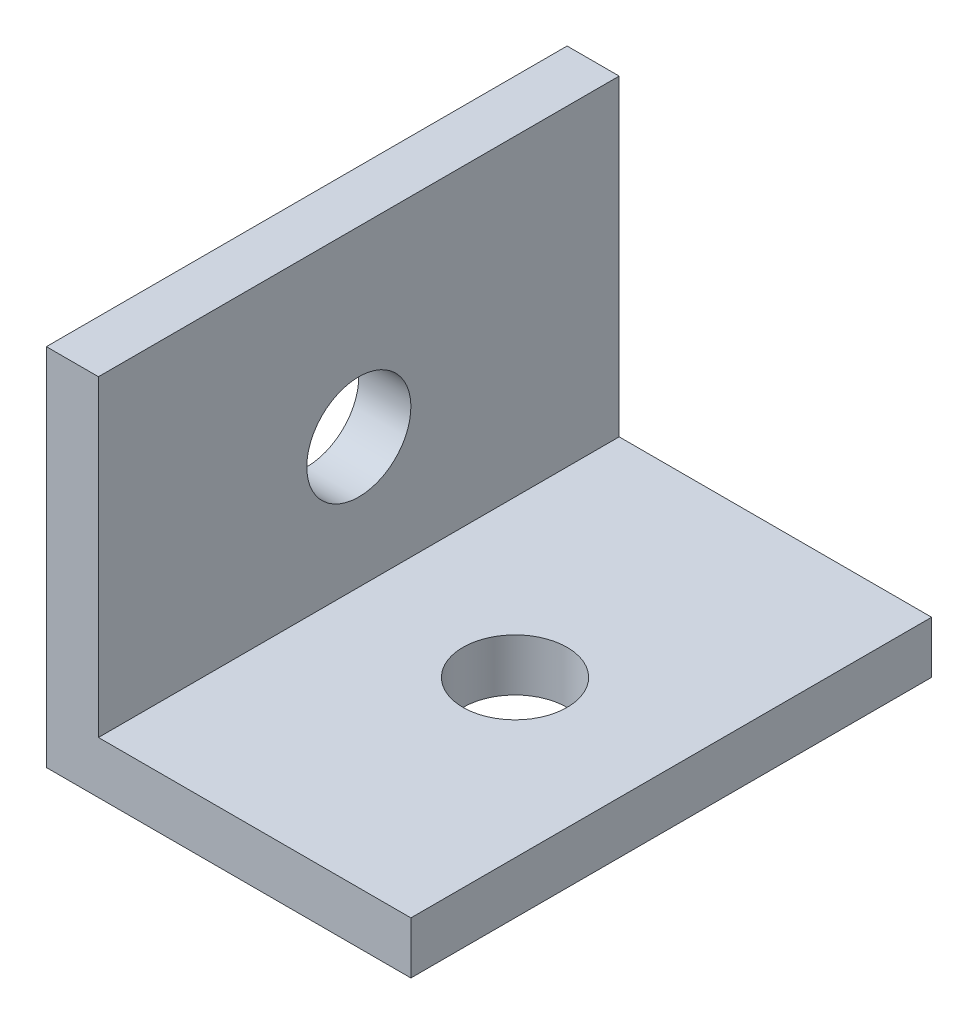
ISO-10303-21;
HEADER;
FILE_DESCRIPTION(('STEP AP214'),'2;1');
FILE_NAME('part.step','',(''),(''),'','','');
FILE_SCHEMA(('AUTOMOTIVE_DESIGN { 1 0 10303 214 1 1 1 1 }'));
ENDSEC;
DATA;
#1=APPLICATION_CONTEXT('core data for automotive mechanical design processes');
#2=APPLICATION_PROTOCOL_DEFINITION('international standard','automotive_design',2000,#1);
#3=PRODUCT_CONTEXT('',#1,'mechanical');
#4=PRODUCT('Part','Part','',(#3));
#5=PRODUCT_RELATED_PRODUCT_CATEGORY('part','',(#4));
#6=PRODUCT_DEFINITION_FORMATION('','',#4);
#7=PRODUCT_DEFINITION_CONTEXT('part definition',#1,'design');
#8=PRODUCT_DEFINITION('design','',#6,#7);
#9=PRODUCT_DEFINITION_SHAPE('','',#8);
#10=(LENGTH_UNIT() NAMED_UNIT(*) SI_UNIT(.MILLI.,.METRE.));
#11=(NAMED_UNIT(*) PLANE_ANGLE_UNIT() SI_UNIT($,.RADIAN.));
#12=(NAMED_UNIT(*) SI_UNIT($,.STERADIAN.) SOLID_ANGLE_UNIT());
#13=UNCERTAINTY_MEASURE_WITH_UNIT(LENGTH_MEASURE(1.E-05),#10,'distance_accuracy_value','');
#14=(GEOMETRIC_REPRESENTATION_CONTEXT(3) GLOBAL_UNCERTAINTY_ASSIGNED_CONTEXT((#13)) GLOBAL_UNIT_ASSIGNED_CONTEXT((#10,
#11,#12)) REPRESENTATION_CONTEXT('',''));
#15=CARTESIAN_POINT('',(0.,0.,0.));
#16=DIRECTION('',(0.,0.,1.));
#17=DIRECTION('',(1.,0.,0.));
#18=AXIS2_PLACEMENT_3D('',#15,#16,#17);
#19=CARTESIAN_POINT('',(0.,35.,50.));
#20=DIRECTION('',(1.,0.,0.));
#21=DIRECTION('',(0.,1.,0.));
#22=AXIS2_PLACEMENT_3D('',#19,#20,#21);
#23=PLANE('',#22);
#24=CARTESIAN_POINT('',(0.,17.5,25.));
#25=DIRECTION('',(-1.,0.,0.));
#26=DIRECTION('',(0.,-1.,0.));
#27=AXIS2_PLACEMENT_3D('',#24,#25,#26);
#28=CIRCLE('',#27,4.99916576836766);
#29=CARTESIAN_POINT('',(0.,12.5008342316323,25.));
#30=VERTEX_POINT('',#29);
#31=EDGE_CURVE('E183',#30,#30,#28,.T.);
#32=ORIENTED_EDGE('',*,*,#31,.F.);
#33=EDGE_LOOP('',(#32));
#34=FACE_BOUND('',#33,.T.);
#35=DIRECTION('',(0.,-1.,0.));
#36=VECTOR('',#35,1.);
#37=CARTESIAN_POINT('',(0.,35.,0.));
#38=LINE('',#37,#36);
#39=CARTESIAN_POINT('',(0.,35.,0.));
#40=VERTEX_POINT('',#39);
#41=CARTESIAN_POINT('',(0.,0.,0.));
#42=VERTEX_POINT('',#41);
#43=EDGE_CURVE('E129',#40,#42,#38,.T.);
#44=ORIENTED_EDGE('',*,*,#43,.T.);
#45=DIRECTION('',(0.,0.,-1.));
#46=VECTOR('',#45,1.);
#47=CARTESIAN_POINT('',(0.,0.,50.));
#48=LINE('',#47,#46);
#49=CARTESIAN_POINT('',(0.,0.,50.));
#50=VERTEX_POINT('',#49);
#51=EDGE_CURVE('E11',#50,#42,#48,.T.);
#52=ORIENTED_EDGE('',*,*,#51,.F.);
#53=DIRECTION('',(0.,-1.,0.));
#54=VECTOR('',#53,1.);
#55=CARTESIAN_POINT('',(0.,35.,50.));
#56=LINE('',#55,#54);
#57=CARTESIAN_POINT('',(0.,35.,50.));
#58=VERTEX_POINT('',#57);
#59=EDGE_CURVE('E145',#58,#50,#56,.T.);
#60=ORIENTED_EDGE('',*,*,#59,.F.);
#61=DIRECTION('',(0.,0.,-1.));
#62=VECTOR('',#61,1.);
#63=CARTESIAN_POINT('',(0.,35.,50.));
#64=LINE('',#63,#62);
#65=EDGE_CURVE('E125',#58,#40,#64,.T.);
#66=ORIENTED_EDGE('',*,*,#65,.T.);
#67=EDGE_LOOP('',(#44,#52,#60,#66));
#68=FACE_BOUND('',#67,.T.);
#69=ADVANCED_FACE('F39',(#34,#68),#23,.F.);
#70=CARTESIAN_POINT('',(0.,0.,50.));
#71=DIRECTION('',(0.,1.,0.));
#72=DIRECTION('',(0.,0.,1.));
#73=AXIS2_PLACEMENT_3D('',#70,#71,#72);
#74=PLANE('',#73);
#75=CARTESIAN_POINT('',(20.,0.,25.));
#76=DIRECTION('',(0.,1.,0.));
#77=DIRECTION('',(0.,0.,1.));
#78=AXIS2_PLACEMENT_3D('',#75,#76,#77);
#79=CIRCLE('',#78,5.);
#80=CARTESIAN_POINT('',(20.,0.,30.));
#81=VERTEX_POINT('',#80);
#82=EDGE_CURVE('E186',#81,#81,#79,.T.);
#83=ORIENTED_EDGE('',*,*,#82,.T.);
#84=EDGE_LOOP('',(#83));
#85=FACE_BOUND('',#84,.T.);
#86=DIRECTION('',(1.,0.,0.));
#87=VECTOR('',#86,1.);
#88=CARTESIAN_POINT('',(0.,0.,0.));
#89=LINE('',#88,#87);
#90=CARTESIAN_POINT('',(35.,0.,0.));
#91=VERTEX_POINT('',#90);
#92=EDGE_CURVE('E133',#42,#91,#89,.T.);
#93=ORIENTED_EDGE('',*,*,#92,.T.);
#94=DIRECTION('',(0.,0.,-1.));
#95=VECTOR('',#94,1.);
#96=CARTESIAN_POINT('',(35.,0.,50.));
#97=LINE('',#96,#95);
#98=CARTESIAN_POINT('',(35.,0.,50.));
#99=VERTEX_POINT('',#98);
#100=EDGE_CURVE('E49',#99,#91,#97,.T.);
#101=ORIENTED_EDGE('',*,*,#100,.F.);
#102=DIRECTION('',(1.,0.,0.));
#103=VECTOR('',#102,1.);
#104=CARTESIAN_POINT('',(0.,0.,50.));
#105=LINE('',#104,#103);
#106=EDGE_CURVE('E94',#50,#99,#105,.T.);
#107=ORIENTED_EDGE('',*,*,#106,.F.);
#108=ORIENTED_EDGE('',*,*,#51,.T.);
#109=EDGE_LOOP('',(#93,#101,#107,#108));
#110=FACE_BOUND('',#109,.T.);
#111=ADVANCED_FACE('F175',(#85,#110),#74,.F.);
#112=CARTESIAN_POINT('',(35.,0.,50.));
#113=DIRECTION('',(-1.,0.,0.));
#114=DIRECTION('',(0.,0.,1.));
#115=AXIS2_PLACEMENT_3D('',#112,#113,#114);
#116=PLANE('',#115);
#117=DIRECTION('',(0.,1.,0.));
#118=VECTOR('',#117,1.);
#119=CARTESIAN_POINT('',(35.,0.,0.));
#120=LINE('',#119,#118);
#121=CARTESIAN_POINT('',(35.,5.,0.));
#122=VERTEX_POINT('',#121);
#123=EDGE_CURVE('E136',#91,#122,#120,.T.);
#124=ORIENTED_EDGE('',*,*,#123,.T.);
#125=DIRECTION('',(0.,0.,-1.));
#126=VECTOR('',#125,1.);
#127=CARTESIAN_POINT('',(35.,5.,50.));
#128=LINE('',#127,#126);
#129=CARTESIAN_POINT('',(35.,5.,50.));
#130=VERTEX_POINT('',#129);
#131=EDGE_CURVE('E118',#130,#122,#128,.T.);
#132=ORIENTED_EDGE('',*,*,#131,.F.);
#133=DIRECTION('',(0.,1.,0.));
#134=VECTOR('',#133,1.);
#135=CARTESIAN_POINT('',(35.,0.,50.));
#136=LINE('',#135,#134);
#137=EDGE_CURVE('E107',#99,#130,#136,.T.);
#138=ORIENTED_EDGE('',*,*,#137,.F.);
#139=ORIENTED_EDGE('',*,*,#100,.T.);
#140=EDGE_LOOP('',(#124,#132,#138,#139));
#141=FACE_BOUND('',#140,.T.);
#142=ADVANCED_FACE('F156',(#141),#116,.F.);
#143=CARTESIAN_POINT('',(35.,5.,50.));
#144=DIRECTION('',(0.,-1.,0.));
#145=DIRECTION('',(1.,0.,0.));
#146=AXIS2_PLACEMENT_3D('',#143,#144,#145);
#147=PLANE('',#146);
#148=CARTESIAN_POINT('',(20.,5.,25.));
#149=DIRECTION('',(0.,1.,0.));
#150=DIRECTION('',(-1.,0.,0.));
#151=AXIS2_PLACEMENT_3D('',#148,#149,#150);
#152=CIRCLE('',#151,5.);
#153=CARTESIAN_POINT('',(15.,5.,25.));
#154=VERTEX_POINT('',#153);
#155=EDGE_CURVE('E192',#154,#154,#152,.T.);
#156=ORIENTED_EDGE('',*,*,#155,.F.);
#157=EDGE_LOOP('',(#156));
#158=FACE_BOUND('',#157,.T.);
#159=DIRECTION('',(-1.,0.,0.));
#160=VECTOR('',#159,1.);
#161=CARTESIAN_POINT('',(35.,5.,0.));
#162=LINE('',#161,#160);
#163=CARTESIAN_POINT('',(5.,5.,0.));
#164=VERTEX_POINT('',#163);
#165=EDGE_CURVE('E116',#122,#164,#162,.T.);
#166=ORIENTED_EDGE('',*,*,#165,.T.);
#167=DIRECTION('',(0.,0.,-1.));
#168=VECTOR('',#167,1.);
#169=CARTESIAN_POINT('',(5.,5.,50.));
#170=LINE('',#169,#168);
#171=CARTESIAN_POINT('',(5.,5.,50.));
#172=VERTEX_POINT('',#171);
#173=EDGE_CURVE('E113',#172,#164,#170,.T.);
#174=ORIENTED_EDGE('',*,*,#173,.F.);
#175=DIRECTION('',(-1.,0.,0.));
#176=VECTOR('',#175,1.);
#177=CARTESIAN_POINT('',(35.,5.,50.));
#178=LINE('',#177,#176);
#179=EDGE_CURVE('E101',#130,#172,#178,.T.);
#180=ORIENTED_EDGE('',*,*,#179,.F.);
#181=ORIENTED_EDGE('',*,*,#131,.T.);
#182=EDGE_LOOP('',(#166,#174,#180,#181));
#183=FACE_BOUND('',#182,.T.);
#184=ADVANCED_FACE('F114',(#158,#183),#147,.F.);
#185=CARTESIAN_POINT('',(5.,5.,50.));
#186=DIRECTION('',(-1.,0.,0.));
#187=DIRECTION('',(0.,-1.,0.));
#188=AXIS2_PLACEMENT_3D('',#185,#186,#187);
#189=PLANE('',#188);
#190=CARTESIAN_POINT('',(5.,17.5,25.));
#191=DIRECTION('',(-1.,0.,0.));
#192=DIRECTION('',(0.,-1.,0.));
#193=AXIS2_PLACEMENT_3D('',#190,#191,#192);
#194=CIRCLE('',#193,4.99916576836766);
#195=CARTESIAN_POINT('',(5.,12.5008342316323,25.));
#196=VERTEX_POINT('',#195);
#197=EDGE_CURVE('E42',#196,#196,#194,.T.);
#198=ORIENTED_EDGE('',*,*,#197,.T.);
#199=EDGE_LOOP('',(#198));
#200=FACE_BOUND('',#199,.T.);
#201=DIRECTION('',(0.,1.,0.));
#202=VECTOR('',#201,1.);
#203=CARTESIAN_POINT('',(5.,5.,0.));
#204=LINE('',#203,#202);
#205=CARTESIAN_POINT('',(5.,35.,0.));
#206=VERTEX_POINT('',#205);
#207=EDGE_CURVE('E80',#164,#206,#204,.T.);
#208=ORIENTED_EDGE('',*,*,#207,.T.);
#209=DIRECTION('',(0.,0.,-1.));
#210=VECTOR('',#209,1.);
#211=CARTESIAN_POINT('',(5.,35.,50.));
#212=LINE('',#211,#210);
#213=CARTESIAN_POINT('',(5.,35.,50.));
#214=VERTEX_POINT('',#213);
#215=EDGE_CURVE('E119',#214,#206,#212,.T.);
#216=ORIENTED_EDGE('',*,*,#215,.F.);
#217=DIRECTION('',(0.,1.,0.));
#218=VECTOR('',#217,1.);
#219=CARTESIAN_POINT('',(5.,5.,50.));
#220=LINE('',#219,#218);
#221=EDGE_CURVE('E105',#172,#214,#220,.T.);
#222=ORIENTED_EDGE('',*,*,#221,.F.);
#223=ORIENTED_EDGE('',*,*,#173,.T.);
#224=EDGE_LOOP('',(#208,#216,#222,#223));
#225=FACE_BOUND('',#224,.T.);
#226=ADVANCED_FACE('F121',(#200,#225),#189,.F.);
#227=CARTESIAN_POINT('',(5.,35.,50.));
#228=DIRECTION('',(0.,-1.,0.));
#229=DIRECTION('',(0.,0.,-1.));
#230=AXIS2_PLACEMENT_3D('',#227,#228,#229);
#231=PLANE('',#230);
#232=DIRECTION('',(-1.,0.,0.));
#233=VECTOR('',#232,1.);
#234=CARTESIAN_POINT('',(5.,35.,0.));
#235=LINE('',#234,#233);
#236=EDGE_CURVE('E86',#206,#40,#235,.T.);
#237=ORIENTED_EDGE('',*,*,#236,.T.);
#238=ORIENTED_EDGE('',*,*,#65,.F.);
#239=DIRECTION('',(-1.,0.,0.));
#240=VECTOR('',#239,1.);
#241=CARTESIAN_POINT('',(5.,35.,50.));
#242=LINE('',#241,#240);
#243=EDGE_CURVE('E57',#214,#58,#242,.T.);
#244=ORIENTED_EDGE('',*,*,#243,.F.);
#245=ORIENTED_EDGE('',*,*,#215,.T.);
#246=EDGE_LOOP('',(#237,#238,#244,#245));
#247=FACE_BOUND('',#246,.T.);
#248=ADVANCED_FACE('F163',(#247),#231,.F.);
#249=CARTESIAN_POINT('',(0.,0.,50.));
#250=DIRECTION('',(0.,0.,1.));
#251=DIRECTION('',(1.,0.,0.));
#252=AXIS2_PLACEMENT_3D('',#249,#250,#251);
#253=PLANE('',#252);
#254=ORIENTED_EDGE('',*,*,#59,.T.);
#255=ORIENTED_EDGE('',*,*,#106,.T.);
#256=ORIENTED_EDGE('',*,*,#137,.T.);
#257=ORIENTED_EDGE('',*,*,#179,.T.);
#258=ORIENTED_EDGE('',*,*,#221,.T.);
#259=ORIENTED_EDGE('',*,*,#243,.T.);
#260=EDGE_LOOP('',(#254,#255,#256,#257,#258,#259));
#261=FACE_BOUND('',#260,.T.);
#262=ADVANCED_FACE('F103',(#261),#253,.T.);
#263=CARTESIAN_POINT('',(0.,0.,0.));
#264=DIRECTION('',(0.,0.,1.));
#265=DIRECTION('',(1.,0.,0.));
#266=AXIS2_PLACEMENT_3D('',#263,#264,#265);
#267=PLANE('',#266);
#268=ORIENTED_EDGE('',*,*,#43,.F.);
#269=ORIENTED_EDGE('',*,*,#236,.F.);
#270=ORIENTED_EDGE('',*,*,#207,.F.);
#271=ORIENTED_EDGE('',*,*,#165,.F.);
#272=ORIENTED_EDGE('',*,*,#123,.F.);
#273=ORIENTED_EDGE('',*,*,#92,.F.);
#274=EDGE_LOOP('',(#268,#269,#270,#271,#272,#273));
#275=FACE_BOUND('',#274,.T.);
#276=ADVANCED_FACE('F159',(#275),#267,.F.);
#277=CARTESIAN_POINT('',(35.,17.5,25.));
#278=DIRECTION('',(-1.,0.,0.));
#279=DIRECTION('',(0.,-1.,0.));
#280=AXIS2_PLACEMENT_3D('',#277,#278,#279);
#281=CYLINDRICAL_SURFACE('',#280,4.99916576836766);
#282=ORIENTED_EDGE('',*,*,#31,.T.);
#283=EDGE_LOOP('',(#282));
#284=FACE_BOUND('',#283,.T.);
#285=ORIENTED_EDGE('',*,*,#197,.F.);
#286=EDGE_LOOP('',(#285));
#287=FACE_BOUND('',#286,.T.);
#288=ADVANCED_FACE('F225',(#284,#287),#281,.F.);
#289=CARTESIAN_POINT('',(20.,-45.,25.));
#290=DIRECTION('',(0.,1.,0.));
#291=DIRECTION('',(-1.,0.,0.));
#292=AXIS2_PLACEMENT_3D('',#289,#290,#291);
#293=CYLINDRICAL_SURFACE('',#292,5.);
#294=ORIENTED_EDGE('',*,*,#155,.T.);
#295=EDGE_LOOP('',(#294));
#296=FACE_BOUND('',#295,.T.);
#297=ORIENTED_EDGE('',*,*,#82,.F.);
#298=EDGE_LOOP('',(#297));
#299=FACE_BOUND('',#298,.T.);
#300=ADVANCED_FACE('F204',(#296,#299),#293,.F.);
#301=CLOSED_SHELL('',(#69,#111,#142,#184,#226,#248,#262,#276,#288,#300));
#302=MANIFOLD_SOLID_BREP('B2',#301);
#303=ADVANCED_BREP_SHAPE_REPRESENTATION('',(#18,#302),#14);
#304=SHAPE_DEFINITION_REPRESENTATION(#9,#303);
ENDSEC;
END-ISO-10303-21;
